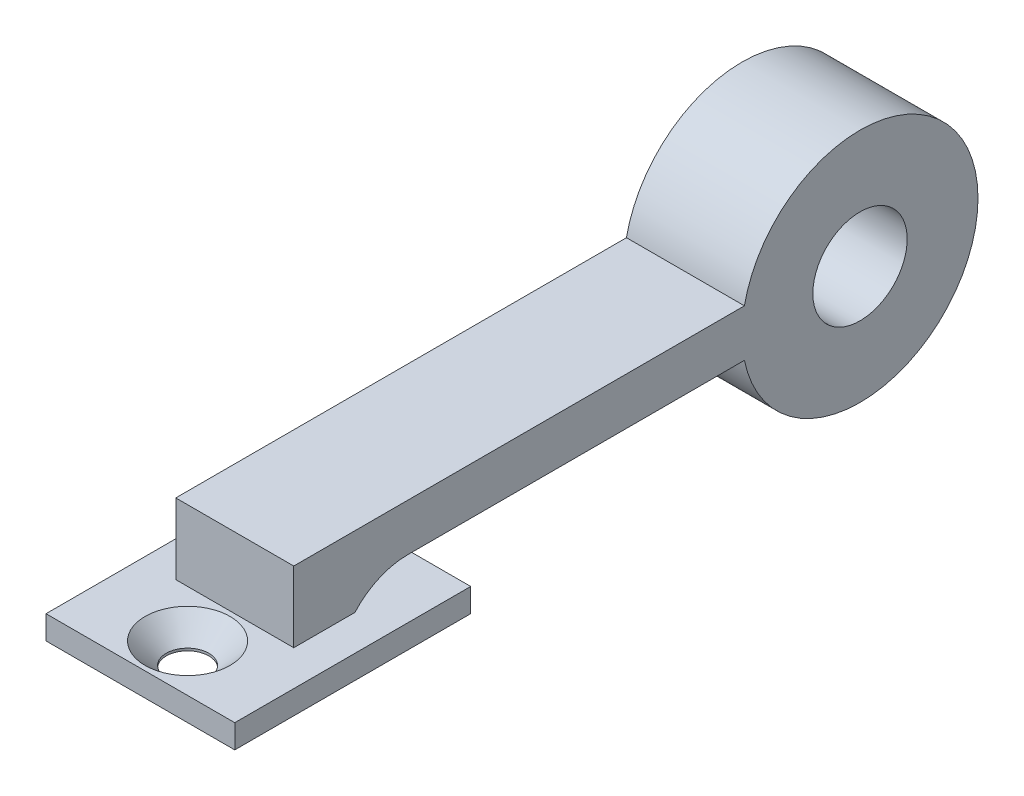
ISO-10303-21;
HEADER;
FILE_DESCRIPTION(('STEP AP214'),'2;1');
FILE_NAME('part.step','',(''),(''),'','','');
FILE_SCHEMA(('AUTOMOTIVE_DESIGN { 1 0 10303 214 1 1 1 1 }'));
ENDSEC;
DATA;
#1=APPLICATION_CONTEXT('core data for automotive mechanical design processes');
#2=APPLICATION_PROTOCOL_DEFINITION('international standard','automotive_design',2000,#1);
#3=PRODUCT_CONTEXT('',#1,'mechanical');
#4=PRODUCT('Part','Part','',(#3));
#5=PRODUCT_RELATED_PRODUCT_CATEGORY('part','',(#4));
#6=PRODUCT_DEFINITION_FORMATION('','',#4);
#7=PRODUCT_DEFINITION_CONTEXT('part definition',#1,'design');
#8=PRODUCT_DEFINITION('design','',#6,#7);
#9=PRODUCT_DEFINITION_SHAPE('','',#8);
#10=(LENGTH_UNIT() NAMED_UNIT(*) SI_UNIT(.MILLI.,.METRE.));
#11=(NAMED_UNIT(*) PLANE_ANGLE_UNIT() SI_UNIT($,.RADIAN.));
#12=(NAMED_UNIT(*) SI_UNIT($,.STERADIAN.) SOLID_ANGLE_UNIT());
#13=UNCERTAINTY_MEASURE_WITH_UNIT(LENGTH_MEASURE(1.E-05),#10,'distance_accuracy_value','');
#14=(GEOMETRIC_REPRESENTATION_CONTEXT(3) GLOBAL_UNCERTAINTY_ASSIGNED_CONTEXT((#13)) GLOBAL_UNIT_ASSIGNED_CONTEXT((#10,
#11,#12)) REPRESENTATION_CONTEXT('',''));
#15=CARTESIAN_POINT('',(0.,0.,0.));
#16=DIRECTION('',(0.,0.,1.));
#17=DIRECTION('',(1.,0.,0.));
#18=AXIS2_PLACEMENT_3D('',#15,#16,#17);
#19=CARTESIAN_POINT('',(4.99999999999989,0.,1.));
#20=DIRECTION('',(0.,0.,-0.999999999999999));
#21=DIRECTION('',(0.,1.,0.));
#22=AXIS2_PLACEMENT_3D('',#19,#20,#21);
#23=PLANE('',#22);
#24=DIRECTION('',(-0.999999999999996,0.,0.));
#25=VECTOR('',#24,1.);
#26=CARTESIAN_POINT('',(4.99999999999989,0.99999999999989,1.));
#27=LINE('',#26,#25);
#28=CARTESIAN_POINT('',(4.99999999999989,1.00000000000011,1.));
#29=VERTEX_POINT('',#28);
#30=CARTESIAN_POINT('',(0.,0.99999999999989,1.));
#31=VERTEX_POINT('',#30);
#32=EDGE_CURVE('E95',#29,#31,#27,.T.);
#33=ORIENTED_EDGE('',*,*,#32,.F.);
#34=DIRECTION('',(0.,-1.,0.));
#35=VECTOR('',#34,1.);
#36=CARTESIAN_POINT('',(4.99999999999989,0.,1.));
#37=LINE('',#36,#35);
#38=CARTESIAN_POINT('',(4.99999999999989,4.,1.));
#39=VERTEX_POINT('',#38);
#40=EDGE_CURVE('E207',#39,#29,#37,.T.);
#41=ORIENTED_EDGE('',*,*,#40,.F.);
#42=DIRECTION('',(-0.999999999999996,0.,0.));
#43=VECTOR('',#42,1.);
#44=CARTESIAN_POINT('',(4.99999999999989,4.,1.));
#45=LINE('',#44,#43);
#46=CARTESIAN_POINT('',(0.,4.,1.));
#47=VERTEX_POINT('',#46);
#48=EDGE_CURVE('E221',#39,#47,#45,.T.);
#49=ORIENTED_EDGE('',*,*,#48,.T.);
#50=DIRECTION('',(0.,-1.,0.));
#51=VECTOR('',#50,1.);
#52=CARTESIAN_POINT('',(0.,0.,1.));
#53=LINE('',#52,#51);
#54=EDGE_CURVE('E215',#47,#31,#53,.T.);
#55=ORIENTED_EDGE('',*,*,#54,.T.);
#56=EDGE_LOOP('',(#33,#41,#49,#55));
#57=FACE_BOUND('',#56,.T.);
#58=ADVANCED_FACE('F72',(#57),#23,.F.);
#59=CARTESIAN_POINT('',(0.,0.,0.));
#60=DIRECTION('',(0.999999999999996,0.,0.));
#61=DIRECTION('',(0.,0.,-0.999999999999999));
#62=AXIS2_PLACEMENT_3D('',#59,#60,#61);
#63=PLANE('',#62);
#64=CARTESIAN_POINT('',(0.,2.99999999999989,-23.));
#65=DIRECTION('',(0.999999999999996,0.,0.));
#66=DIRECTION('',(0.,0.,-0.999999999999999));
#67=AXIS2_PLACEMENT_3D('',#64,#65,#66);
#68=CIRCLE('',#67,2.);
#69=CARTESIAN_POINT('',(0.,2.99999999999989,-21.));
#70=VERTEX_POINT('',#69);
#71=EDGE_CURVE('E204',#70,#70,#68,.T.);
#72=ORIENTED_EDGE('',*,*,#71,.T.);
#73=EDGE_LOOP('',(#72));
#74=FACE_BOUND('',#73,.T.);
#75=DIRECTION('',(0.,0.,-0.999999999999999));
#76=VECTOR('',#75,1.);
#77=CARTESIAN_POINT('',(0.,0.99999999999989,0.));
#78=LINE('',#77,#76);
#79=CARTESIAN_POINT('',(0.,0.99999999999989,-1.59235914724642));
#80=VERTEX_POINT('',#79);
#81=EDGE_CURVE('E88',#31,#80,#78,.T.);
#82=ORIENTED_EDGE('',*,*,#81,.F.);
#83=ORIENTED_EDGE('',*,*,#54,.F.);
#84=DIRECTION('',(0.,0.,0.999999999999999));
#85=VECTOR('',#84,1.);
#86=CARTESIAN_POINT('',(0.,4.,0.));
#87=LINE('',#86,#85);
#88=CARTESIAN_POINT('',(0.,4.,-18.1010205144336));
#89=VERTEX_POINT('',#88);
#90=EDGE_CURVE('E213',#89,#47,#87,.T.);
#91=ORIENTED_EDGE('',*,*,#90,.F.);
#92=CARTESIAN_POINT('',(0.,2.99999999999989,-23.));
#93=DIRECTION('',(0.999999999999996,0.,0.));
#94=DIRECTION('',(0.,0.,-0.999999999999999));
#95=AXIS2_PLACEMENT_3D('',#92,#93,#94);
#96=CIRCLE('',#95,5.);
#97=CARTESIAN_POINT('',(0.,2.,-18.1010205144336));
#98=VERTEX_POINT('',#97);
#99=EDGE_CURVE('E230',#98,#89,#96,.T.);
#100=ORIENTED_EDGE('',*,*,#99,.F.);
#101=DIRECTION('',(0.,0.,-0.999999999999999));
#102=VECTOR('',#101,1.);
#103=CARTESIAN_POINT('',(0.,2.,0.));
#104=LINE('',#103,#102);
#105=CARTESIAN_POINT('',(0.,2.,-3.82842712474618));
#106=VERTEX_POINT('',#105);
#107=EDGE_CURVE('E208',#106,#98,#104,.T.);
#108=ORIENTED_EDGE('',*,*,#107,.F.);
#109=CARTESIAN_POINT('',(0.,-0.99999999999989,-3.82842712474618));
#110=DIRECTION('',(0.999999999999996,0.,0.));
#111=DIRECTION('',(0.,0.,-0.999999999999999));
#112=AXIS2_PLACEMENT_3D('',#109,#110,#111);
#113=CIRCLE('',#112,3.);
#114=EDGE_CURVE('E239',#106,#80,#113,.T.);
#115=ORIENTED_EDGE('',*,*,#114,.T.);
#116=EDGE_LOOP('',(#82,#83,#91,#100,#108,#115));
#117=FACE_BOUND('',#116,.T.);
#118=ADVANCED_FACE('F252',(#74,#117),#63,.F.);
#119=CARTESIAN_POINT('',(4.99999999999989,0.,0.));
#120=DIRECTION('',(0.999999999999996,0.,0.));
#121=DIRECTION('',(0.,0.,-0.999999999999999));
#122=AXIS2_PLACEMENT_3D('',#119,#120,#121);
#123=PLANE('',#122);
#124=CARTESIAN_POINT('',(4.99999999999995,2.99999999999989,-23.));
#125=DIRECTION('',(0.999999999999996,0.,0.));
#126=DIRECTION('',(0.,0.,-0.999999999999999));
#127=AXIS2_PLACEMENT_3D('',#124,#125,#126);
#128=CIRCLE('',#127,2.);
#129=CARTESIAN_POINT('',(4.99999999999995,2.99999999999989,-21.));
#130=VERTEX_POINT('',#129);
#131=EDGE_CURVE('E227',#130,#130,#128,.T.);
#132=ORIENTED_EDGE('',*,*,#131,.F.);
#133=EDGE_LOOP('',(#132));
#134=FACE_BOUND('',#133,.T.);
#135=ORIENTED_EDGE('',*,*,#40,.T.);
#136=DIRECTION('',(0.,0.,-0.999999999999999));
#137=VECTOR('',#136,1.);
#138=CARTESIAN_POINT('',(4.99999999999989,0.99999999999989,0.));
#139=LINE('',#138,#137);
#140=CARTESIAN_POINT('',(4.99999999999989,0.99999999999989,-1.59235914724642));
#141=VERTEX_POINT('',#140);
#142=EDGE_CURVE('E196',#29,#141,#139,.T.);
#143=ORIENTED_EDGE('',*,*,#142,.T.);
#144=CARTESIAN_POINT('',(4.99999999999989,-0.99999999999989,-3.82842712474618));
#145=DIRECTION('',(0.999999999999996,0.,0.));
#146=DIRECTION('',(0.,0.,-0.999999999999999));
#147=AXIS2_PLACEMENT_3D('',#144,#145,#146);
#148=CIRCLE('',#147,3.);
#149=CARTESIAN_POINT('',(4.99999999999989,2.,-3.82842712474618));
#150=VERTEX_POINT('',#149);
#151=EDGE_CURVE('E81',#141,#150,#148,.F.);
#152=ORIENTED_EDGE('',*,*,#151,.T.);
#153=DIRECTION('',(0.,0.,-0.999999999999999));
#154=VECTOR('',#153,1.);
#155=CARTESIAN_POINT('',(4.99999999999989,2.,0.));
#156=LINE('',#155,#154);
#157=CARTESIAN_POINT('',(4.99999999999995,2.,-18.1010205144336));
#158=VERTEX_POINT('',#157);
#159=EDGE_CURVE('E210',#150,#158,#156,.T.);
#160=ORIENTED_EDGE('',*,*,#159,.T.);
#161=CARTESIAN_POINT('',(4.99999999999995,2.99999999999989,-23.));
#162=DIRECTION('',(0.999999999999996,0.,0.));
#163=DIRECTION('',(0.,0.,-0.999999999999999));
#164=AXIS2_PLACEMENT_3D('',#161,#162,#163);
#165=CIRCLE('',#164,5.);
#166=CARTESIAN_POINT('',(4.99999999999995,4.,-18.1010205144336));
#167=VERTEX_POINT('',#166);
#168=EDGE_CURVE('E216',#158,#167,#165,.T.);
#169=ORIENTED_EDGE('',*,*,#168,.T.);
#170=DIRECTION('',(0.,0.,0.999999999999999));
#171=VECTOR('',#170,1.);
#172=CARTESIAN_POINT('',(4.99999999999989,4.,0.));
#173=LINE('',#172,#171);
#174=EDGE_CURVE('E205',#167,#39,#173,.T.);
#175=ORIENTED_EDGE('',*,*,#174,.T.);
#176=EDGE_LOOP('',(#135,#143,#152,#160,#169,#175));
#177=FACE_BOUND('',#176,.T.);
#178=ADVANCED_FACE('F243',(#134,#177),#123,.T.);
#179=CARTESIAN_POINT('',(4.99999999999989,-0.99999999999989,-3.82842712474618));
#180=DIRECTION('',(-0.999999999999996,0.,0.));
#181=DIRECTION('',(0.,0.,0.999999999999999));
#182=AXIS2_PLACEMENT_3D('',#179,#180,#181);
#183=CYLINDRICAL_SURFACE('',#182,3.);
#184=DIRECTION('',(-0.999999999999996,0.,0.));
#185=VECTOR('',#184,1.);
#186=CARTESIAN_POINT('',(4.99999999999989,0.99999999999989,-1.59235914724642));
#187=LINE('',#186,#185);
#188=EDGE_CURVE('E12',#80,#141,#187,.F.);
#189=ORIENTED_EDGE('',*,*,#188,.F.);
#190=ORIENTED_EDGE('',*,*,#114,.F.);
#191=DIRECTION('',(-0.999999999999996,0.,0.));
#192=VECTOR('',#191,1.);
#193=CARTESIAN_POINT('',(4.99999999999989,2.,-3.82842712474618));
#194=LINE('',#193,#192);
#195=EDGE_CURVE('E226',#150,#106,#194,.T.);
#196=ORIENTED_EDGE('',*,*,#195,.F.);
#197=ORIENTED_EDGE('',*,*,#151,.F.);
#198=EDGE_LOOP('',(#189,#190,#196,#197));
#199=FACE_BOUND('',#198,.T.);
#200=ADVANCED_FACE('F74',(#199),#183,.F.);
#201=CARTESIAN_POINT('',(4.99999999999989,4.,0.));
#202=DIRECTION('',(0.,-1.,0.));
#203=DIRECTION('',(0.,0.,-0.999999999999999));
#204=AXIS2_PLACEMENT_3D('',#201,#202,#203);
#205=PLANE('',#204);
#206=ORIENTED_EDGE('',*,*,#90,.T.);
#207=ORIENTED_EDGE('',*,*,#48,.F.);
#208=ORIENTED_EDGE('',*,*,#174,.F.);
#209=DIRECTION('',(-0.999999999999996,0.,0.));
#210=VECTOR('',#209,1.);
#211=CARTESIAN_POINT('',(4.99999999999995,4.,-18.1010205144336));
#212=LINE('',#211,#210);
#213=EDGE_CURVE('E224',#167,#89,#212,.T.);
#214=ORIENTED_EDGE('',*,*,#213,.T.);
#215=EDGE_LOOP('',(#206,#207,#208,#214));
#216=FACE_BOUND('',#215,.T.);
#217=ADVANCED_FACE('F284',(#216),#205,.F.);
#218=CARTESIAN_POINT('',(4.99999999999989,2.,0.));
#219=DIRECTION('',(0.,1.,0.));
#220=DIRECTION('',(0.,0.,0.999999999999999));
#221=AXIS2_PLACEMENT_3D('',#218,#219,#220);
#222=PLANE('',#221);
#223=ORIENTED_EDGE('',*,*,#159,.F.);
#224=ORIENTED_EDGE('',*,*,#195,.T.);
#225=ORIENTED_EDGE('',*,*,#107,.T.);
#226=DIRECTION('',(-0.999999999999996,0.,0.));
#227=VECTOR('',#226,1.);
#228=CARTESIAN_POINT('',(4.99999999999995,2.,-18.1010205144336));
#229=LINE('',#228,#227);
#230=EDGE_CURVE('E212',#158,#98,#229,.T.);
#231=ORIENTED_EDGE('',*,*,#230,.F.);
#232=EDGE_LOOP('',(#223,#224,#225,#231));
#233=FACE_BOUND('',#232,.T.);
#234=ADVANCED_FACE('F249',(#233),#222,.F.);
#235=CARTESIAN_POINT('',(4.99999999999995,2.99999999999989,-23.));
#236=DIRECTION('',(-0.999999999999996,0.,0.));
#237=DIRECTION('',(0.,0.,0.999999999999999));
#238=AXIS2_PLACEMENT_3D('',#235,#236,#237);
#239=CYLINDRICAL_SURFACE('',#238,2.);
#240=CARTESIAN_POINT('',(4.99999999999995,2.99999999999989,-21.));
#241=CARTESIAN_POINT('',(4.94791666666662,2.99999999999989,-21.));
#242=CARTESIAN_POINT('',(4.89583333333329,2.99999999999989,-21.));
#243=CARTESIAN_POINT('',(4.79166666666662,2.99999999999989,-21.));
#244=CARTESIAN_POINT('',(4.73958333333329,2.99999999999989,-21.));
#245=CARTESIAN_POINT('',(4.63541666666662,2.99999999999989,-21.));
#246=CARTESIAN_POINT('',(4.58333333333329,2.99999999999989,-21.));
#247=CARTESIAN_POINT('',(4.47916666666663,2.99999999999989,-21.));
#248=CARTESIAN_POINT('',(4.42708333333329,2.99999999999989,-21.));
#249=CARTESIAN_POINT('',(4.32291666666663,2.99999999999989,-21.));
#250=CARTESIAN_POINT('',(4.2708333333333,2.99999999999989,-21.));
#251=CARTESIAN_POINT('',(4.16666666666663,2.99999999999989,-21.));
#252=CARTESIAN_POINT('',(4.1145833333333,2.99999999999989,-21.));
#253=CARTESIAN_POINT('',(4.01041666666664,2.99999999999989,-21.));
#254=CARTESIAN_POINT('',(3.9583333333333,2.99999999999989,-21.));
#255=CARTESIAN_POINT('',(3.85416666666664,2.99999999999989,-21.));
#256=CARTESIAN_POINT('',(3.80208333333331,2.99999999999989,-21.));
#257=CARTESIAN_POINT('',(3.69791666666664,2.99999999999989,-21.));
#258=CARTESIAN_POINT('',(3.64583333333331,2.99999999999989,-21.));
#259=CARTESIAN_POINT('',(3.54166666666665,2.99999999999989,-21.));
#260=CARTESIAN_POINT('',(3.48958333333331,2.99999999999989,-21.));
#261=CARTESIAN_POINT('',(3.38541666666665,2.99999999999989,-21.));
#262=CARTESIAN_POINT('',(3.33333333333332,2.99999999999989,-21.));
#263=CARTESIAN_POINT('',(3.22916666666665,2.99999999999989,-21.));
#264=CARTESIAN_POINT('',(3.17708333333332,2.99999999999989,-21.));
#265=CARTESIAN_POINT('',(3.07291666666666,2.99999999999989,-21.));
#266=CARTESIAN_POINT('',(3.02083333333332,2.99999999999989,-21.));
#267=CARTESIAN_POINT('',(2.91666666666666,2.99999999999989,-21.));
#268=CARTESIAN_POINT('',(2.86458333333333,2.99999999999989,-21.));
#269=CARTESIAN_POINT('',(2.76041666666666,2.99999999999989,-21.));
#270=CARTESIAN_POINT('',(2.70833333333333,2.99999999999989,-21.));
#271=CARTESIAN_POINT('',(2.60416666666667,2.99999999999989,-21.));
#272=CARTESIAN_POINT('',(2.55208333333333,2.99999999999989,-21.));
#273=CARTESIAN_POINT('',(2.44791666666667,2.99999999999989,-21.));
#274=CARTESIAN_POINT('',(2.39583333333334,2.99999999999989,-21.));
#275=CARTESIAN_POINT('',(2.29166666666667,2.99999999999989,-21.));
#276=CARTESIAN_POINT('',(2.23958333333334,2.99999999999989,-21.));
#277=CARTESIAN_POINT('',(2.13541666666668,2.99999999999989,-21.));
#278=CARTESIAN_POINT('',(2.08333333333334,2.99999999999989,-21.));
#279=CARTESIAN_POINT('',(1.97916666666668,2.99999999999989,-21.));
#280=CARTESIAN_POINT('',(1.92708333333335,2.99999999999989,-21.));
#281=CARTESIAN_POINT('',(1.82291666666668,2.99999999999989,-21.));
#282=CARTESIAN_POINT('',(1.77083333333335,2.99999999999989,-21.));
#283=CARTESIAN_POINT('',(1.66666666666669,2.99999999999989,-21.));
#284=CARTESIAN_POINT('',(1.61458333333335,2.99999999999989,-21.));
#285=CARTESIAN_POINT('',(1.51041666666669,2.99999999999989,-21.));
#286=CARTESIAN_POINT('',(1.45833333333336,2.99999999999989,-21.));
#287=CARTESIAN_POINT('',(1.35416666666669,2.99999999999989,-21.));
#288=CARTESIAN_POINT('',(1.30208333333336,2.99999999999989,-21.));
#289=CARTESIAN_POINT('',(1.1979166666667,2.99999999999989,-21.));
#290=CARTESIAN_POINT('',(1.14583333333336,2.99999999999989,-21.));
#291=CARTESIAN_POINT('',(1.0416666666667,2.99999999999989,-21.));
#292=CARTESIAN_POINT('',(0.989583333333368,2.99999999999989,-21.));
#293=CARTESIAN_POINT('',(0.885416666666703,2.99999999999989,-21.));
#294=CARTESIAN_POINT('',(0.833333333333371,2.99999999999989,-21.));
#295=CARTESIAN_POINT('',(0.729166666666706,2.99999999999989,-21.));
#296=CARTESIAN_POINT('',(0.677083333333374,2.99999999999989,-21.));
#297=CARTESIAN_POINT('',(0.572916666666709,2.99999999999989,-21.));
#298=CARTESIAN_POINT('',(0.520833333333377,2.99999999999989,-21.));
#299=CARTESIAN_POINT('',(0.416666666666713,2.99999999999989,-21.));
#300=CARTESIAN_POINT('',(0.364583333333381,2.99999999999989,-21.));
#301=CARTESIAN_POINT('',(0.260416666666717,2.99999999999989,-21.));
#302=CARTESIAN_POINT('',(0.208333333333384,2.99999999999989,-21.));
#303=CARTESIAN_POINT('',(0.10416666666672,2.99999999999989,-21.));
#304=CARTESIAN_POINT('',(0.0520833333333877,2.99999999999989,-21.));
#305=CARTESIAN_POINT('',(0.,2.99999999999989,-21.));
#306=B_SPLINE_CURVE_WITH_KNOTS('',3,(#240,#241,#242,#243,#244,#245,#246,#247,#248,#249,#250,
#251,#252,#253,#254,#255,#256,#257,#258,#259,#260,#261,#262,#263,#264,#265,#266,#267,#268,#269,
#270,#271,#272,#273,#274,#275,#276,#277,#278,#279,#280,#281,#282,#283,#284,#285,#286,#287,#288,
#289,#290,#291,#292,#293,#294,#295,#296,#297,#298,#299,#300,#301,#302,#303,#304,#305),
.UNSPECIFIED.,.F.,.F.,(4,2,2,2,2,2,2,2,2,2,2,2,2,2,2,2,2,2,2,2,2,2,2,2,2,2,2,2,2,2,2,2,4),(0.,
0.156249999999998,0.312499999999994,0.468749999999991,0.624999999999988,0.781249999999984,
0.937499999999981,1.09374999999998,1.24999999999997,1.40624999999997,1.56249999999997,
1.71874999999996,1.87499999999996,2.03124999999996,2.18749999999995,2.34374999999995,
2.49999999999995,2.65624999999994,2.81249999999994,2.96874999999994,3.12499999999993,
3.28124999999993,3.43749999999993,3.59374999999992,3.74999999999992,3.90624999999992,
4.06249999999991,4.21874999999991,4.37499999999991,4.5312499999999,4.6874999999999,
4.8437499999999,4.99999999999989),.UNSPECIFIED.);
#307=EDGE_CURVE('BSEAM258',#130,#70,#306,.T.);
#308=ORIENTED_EDGE('',*,*,#131,.T.);
#309=ORIENTED_EDGE('',*,*,#71,.F.);
#310=ORIENTED_EDGE('',*,*,#307,.T.);
#311=ORIENTED_EDGE('',*,*,#307,.F.);
#312=EDGE_LOOP('',(#308,#310,#309,#311));
#313=FACE_BOUND('',#312,.T.);
#314=ADVANCED_FACE('F258',(#313),#239,.F.);
#315=CARTESIAN_POINT('',(4.99999999999995,2.99999999999989,-23.));
#316=DIRECTION('',(-0.999999999999996,0.,0.));
#317=DIRECTION('',(0.,0.,0.999999999999999));
#318=AXIS2_PLACEMENT_3D('',#315,#316,#317);
#319=CYLINDRICAL_SURFACE('',#318,5.);
#320=ORIENTED_EDGE('',*,*,#99,.T.);
#321=ORIENTED_EDGE('',*,*,#213,.F.);
#322=ORIENTED_EDGE('',*,*,#168,.F.);
#323=ORIENTED_EDGE('',*,*,#230,.T.);
#324=EDGE_LOOP('',(#320,#321,#322,#323));
#325=FACE_BOUND('',#324,.T.);
#326=ADVANCED_FACE('F255',(#325),#319,.T.);
#327=CARTESIAN_POINT('',(0.,0.99999999999989,0.));
#328=DIRECTION('',(0.,-1.,0.));
#329=DIRECTION('',(0.,0.,-0.999999999999999));
#330=AXIS2_PLACEMENT_3D('',#327,#328,#329);
#331=PLANE('',#330);
#332=CARTESIAN_POINT('',(2.49999999999995,0.99999999999989,3.));
#333=DIRECTION('',(0.,1.,0.));
#334=DIRECTION('',(0.,0.,0.999999999999999));
#335=AXIS2_PLACEMENT_3D('',#332,#333,#334);
#336=CIRCLE('',#335,1.8);
#337=CARTESIAN_POINT('',(2.49999999999995,0.999999999999889,4.8));
#338=VERTEX_POINT('',#337);
#339=EDGE_CURVE('E331',#338,#338,#336,.T.);
#340=ORIENTED_EDGE('',*,*,#339,.F.);
#341=EDGE_LOOP('',(#340));
#342=FACE_BOUND('',#341,.T.);
#343=DIRECTION('',(0.,0.,-0.999999999999999));
#344=VECTOR('',#343,1.);
#345=CARTESIAN_POINT('',(-1.50000000000006,0.99999999999989,-5.));
#346=LINE('',#345,#344);
#347=CARTESIAN_POINT('',(-1.50000000000006,0.99999999999989,5.));
#348=VERTEX_POINT('',#347);
#349=CARTESIAN_POINT('',(-1.50000000000006,0.99999999999989,-5.));
#350=VERTEX_POINT('',#349);
#351=EDGE_CURVE('E172',#348,#350,#346,.T.);
#352=ORIENTED_EDGE('',*,*,#351,.F.);
#353=DIRECTION('',(-0.999999999999996,0.,0.));
#354=VECTOR('',#353,1.);
#355=CARTESIAN_POINT('',(6.49999999999995,0.99999999999989,5.));
#356=LINE('',#355,#354);
#357=CARTESIAN_POINT('',(6.49999999999995,0.99999999999989,5.));
#358=VERTEX_POINT('',#357);
#359=EDGE_CURVE('E164',#358,#348,#356,.T.);
#360=ORIENTED_EDGE('',*,*,#359,.F.);
#361=DIRECTION('',(0.,0.,0.999999999999999));
#362=VECTOR('',#361,1.);
#363=CARTESIAN_POINT('',(6.49999999999995,0.99999999999989,-5.));
#364=LINE('',#363,#362);
#365=CARTESIAN_POINT('',(6.49999999999995,0.99999999999989,-5.));
#366=VERTEX_POINT('',#365);
#367=EDGE_CURVE('E175',#366,#358,#364,.T.);
#368=ORIENTED_EDGE('',*,*,#367,.F.);
#369=DIRECTION('',(0.999999999999996,0.,0.));
#370=VECTOR('',#369,1.);
#371=CARTESIAN_POINT('',(6.49999999999995,0.99999999999989,-5.));
#372=LINE('',#371,#370);
#373=EDGE_CURVE('E156',#350,#366,#372,.T.);
#374=ORIENTED_EDGE('',*,*,#373,.F.);
#375=EDGE_LOOP('',(#352,#360,#368,#374));
#376=FACE_BOUND('',#375,.T.);
#377=ORIENTED_EDGE('',*,*,#142,.F.);
#378=ORIENTED_EDGE('',*,*,#32,.T.);
#379=ORIENTED_EDGE('',*,*,#81,.T.);
#380=ORIENTED_EDGE('',*,*,#188,.T.);
#381=EDGE_LOOP('',(#377,#378,#379,#380));
#382=FACE_BOUND('',#381,.T.);
#383=ADVANCED_FACE('F169',(#342,#376,#382),#331,.F.);
#384=CARTESIAN_POINT('',(-1.50000000000006,0.99999999999989,-5.));
#385=DIRECTION('',(-0.999999999999996,0.,0.));
#386=DIRECTION('',(0.,0.,0.999999999999999));
#387=AXIS2_PLACEMENT_3D('',#384,#385,#386);
#388=PLANE('',#387);
#389=DIRECTION('',(0.,0.,-0.999999999999999));
#390=VECTOR('',#389,1.);
#391=CARTESIAN_POINT('',(-1.50000000000006,0.,-5.));
#392=LINE('',#391,#390);
#393=CARTESIAN_POINT('',(-1.50000000000006,0.,5.));
#394=VERTEX_POINT('',#393);
#395=CARTESIAN_POINT('',(-1.50000000000006,0.,-5.));
#396=VERTEX_POINT('',#395);
#397=EDGE_CURVE('E190',#394,#396,#392,.T.);
#398=ORIENTED_EDGE('',*,*,#397,.F.);
#399=DIRECTION('',(0.,-1.,0.));
#400=VECTOR('',#399,1.);
#401=CARTESIAN_POINT('',(-1.50000000000006,0.99999999999989,5.));
#402=LINE('',#401,#400);
#403=EDGE_CURVE('E178',#348,#394,#402,.T.);
#404=ORIENTED_EDGE('',*,*,#403,.F.);
#405=ORIENTED_EDGE('',*,*,#351,.T.);
#406=DIRECTION('',(0.,-1.,0.));
#407=VECTOR('',#406,1.);
#408=CARTESIAN_POINT('',(-1.50000000000006,0.99999999999989,-5.));
#409=LINE('',#408,#407);
#410=EDGE_CURVE('E153',#350,#396,#409,.T.);
#411=ORIENTED_EDGE('',*,*,#410,.T.);
#412=EDGE_LOOP('',(#398,#404,#405,#411));
#413=FACE_BOUND('',#412,.T.);
#414=ADVANCED_FACE('F177',(#413),#388,.T.);
#415=CARTESIAN_POINT('',(6.49999999999995,0.99999999999989,5.));
#416=DIRECTION('',(0.,0.,0.999999999999999));
#417=DIRECTION('',(0.,-1.,0.));
#418=AXIS2_PLACEMENT_3D('',#415,#416,#417);
#419=PLANE('',#418);
#420=DIRECTION('',(-0.999999999999996,0.,0.));
#421=VECTOR('',#420,1.);
#422=CARTESIAN_POINT('',(6.49999999999995,0.,5.));
#423=LINE('',#422,#421);
#424=CARTESIAN_POINT('',(6.49999999999995,0.,5.));
#425=VERTEX_POINT('',#424);
#426=EDGE_CURVE('E179',#425,#394,#423,.T.);
#427=ORIENTED_EDGE('',*,*,#426,.F.);
#428=DIRECTION('',(0.,-1.,0.));
#429=VECTOR('',#428,1.);
#430=CARTESIAN_POINT('',(6.49999999999995,0.99999999999989,5.));
#431=LINE('',#430,#429);
#432=EDGE_CURVE('E197',#358,#425,#431,.T.);
#433=ORIENTED_EDGE('',*,*,#432,.F.);
#434=ORIENTED_EDGE('',*,*,#359,.T.);
#435=ORIENTED_EDGE('',*,*,#403,.T.);
#436=EDGE_LOOP('',(#427,#433,#434,#435));
#437=FACE_BOUND('',#436,.T.);
#438=ADVANCED_FACE('F264',(#437),#419,.T.);
#439=CARTESIAN_POINT('',(6.49999999999995,0.99999999999989,-5.));
#440=DIRECTION('',(0.999999999999996,0.,0.));
#441=DIRECTION('',(0.,0.,-0.999999999999999));
#442=AXIS2_PLACEMENT_3D('',#439,#440,#441);
#443=PLANE('',#442);
#444=DIRECTION('',(0.,0.,0.999999999999999));
#445=VECTOR('',#444,1.);
#446=CARTESIAN_POINT('',(6.49999999999995,0.,-5.));
#447=LINE('',#446,#445);
#448=CARTESIAN_POINT('',(6.49999999999995,0.,-5.));
#449=VERTEX_POINT('',#448);
#450=EDGE_CURVE('E182',#449,#425,#447,.T.);
#451=ORIENTED_EDGE('',*,*,#450,.F.);
#452=DIRECTION('',(0.,-1.,0.));
#453=VECTOR('',#452,1.);
#454=CARTESIAN_POINT('',(6.49999999999995,0.99999999999989,-5.));
#455=LINE('',#454,#453);
#456=EDGE_CURVE('E163',#366,#449,#455,.T.);
#457=ORIENTED_EDGE('',*,*,#456,.F.);
#458=ORIENTED_EDGE('',*,*,#367,.T.);
#459=ORIENTED_EDGE('',*,*,#432,.T.);
#460=EDGE_LOOP('',(#451,#457,#458,#459));
#461=FACE_BOUND('',#460,.T.);
#462=ADVANCED_FACE('F308',(#461),#443,.T.);
#463=CARTESIAN_POINT('',(6.49999999999995,0.99999999999989,-5.));
#464=DIRECTION('',(0.,0.,-0.999999999999999));
#465=DIRECTION('',(0.,1.,0.));
#466=AXIS2_PLACEMENT_3D('',#463,#464,#465);
#467=PLANE('',#466);
#468=DIRECTION('',(0.999999999999996,0.,0.));
#469=VECTOR('',#468,1.);
#470=CARTESIAN_POINT('',(6.49999999999995,0.,-5.));
#471=LINE('',#470,#469);
#472=EDGE_CURVE('E158',#396,#449,#471,.T.);
#473=ORIENTED_EDGE('',*,*,#472,.F.);
#474=ORIENTED_EDGE('',*,*,#410,.F.);
#475=ORIENTED_EDGE('',*,*,#373,.T.);
#476=ORIENTED_EDGE('',*,*,#456,.T.);
#477=EDGE_LOOP('',(#473,#474,#475,#476));
#478=FACE_BOUND('',#477,.T.);
#479=ADVANCED_FACE('F155',(#478),#467,.T.);
#480=CARTESIAN_POINT('',(4.99999999999989,0.,0.));
#481=DIRECTION('',(0.,1.,0.));
#482=DIRECTION('',(0.,0.,0.999999999999999));
#483=AXIS2_PLACEMENT_3D('',#480,#481,#482);
#484=PLANE('',#483);
#485=CARTESIAN_POINT('',(2.49999999999995,0.,3.));
#486=DIRECTION('',(0.,1.,0.));
#487=DIRECTION('',(0.,0.,0.999999999999999));
#488=AXIS2_PLACEMENT_3D('',#485,#486,#487);
#489=CIRCLE('',#488,0.899999999999995);
#490=CARTESIAN_POINT('',(2.49999999999995,0.,3.9));
#491=VERTEX_POINT('',#490);
#492=EDGE_CURVE('E76',#491,#491,#489,.T.);
#493=ORIENTED_EDGE('',*,*,#492,.T.);
#494=EDGE_LOOP('',(#493));
#495=FACE_BOUND('',#494,.T.);
#496=ORIENTED_EDGE('',*,*,#397,.T.);
#497=ORIENTED_EDGE('',*,*,#472,.T.);
#498=ORIENTED_EDGE('',*,*,#450,.T.);
#499=ORIENTED_EDGE('',*,*,#426,.T.);
#500=EDGE_LOOP('',(#496,#497,#498,#499));
#501=FACE_BOUND('',#500,.T.);
#502=ADVANCED_FACE('F282',(#495,#501),#484,.F.);
#503=CARTESIAN_POINT('',(2.49999999999995,0.99999999999989,3.));
#504=DIRECTION('',(0.,1.,0.));
#505=DIRECTION('',(0.,0.,0.999999999999999));
#506=AXIS2_PLACEMENT_3D('',#503,#504,#505);
#507=CYLINDRICAL_SURFACE('',#506,0.899999999999995);
#508=CARTESIAN_POINT('',(2.49999999999995,0.099999999999989,3.));
#509=DIRECTION('',(0.,1.,0.));
#510=DIRECTION('',(0.,0.,0.999999999999999));
#511=AXIS2_PLACEMENT_3D('',#508,#509,#510);
#512=CIRCLE('',#511,0.899999999999996);
#513=CARTESIAN_POINT('',(2.49999999999995,0.0999999999999887,3.9));
#514=VERTEX_POINT('',#513);
#515=EDGE_CURVE('E185',#514,#514,#512,.T.);
#516=ORIENTED_EDGE('',*,*,#515,.T.);
#517=EDGE_LOOP('',(#516));
#518=FACE_BOUND('',#517,.T.);
#519=ORIENTED_EDGE('',*,*,#492,.F.);
#520=EDGE_LOOP('',(#519));
#521=FACE_BOUND('',#520,.T.);
#522=ADVANCED_FACE('F320',(#518,#521),#507,.F.);
#523=CARTESIAN_POINT('',(2.49999999999995,0.99999999999989,3.));
#524=DIRECTION('',(0.,1.,0.));
#525=DIRECTION('',(0.,0.,0.999999999999999));
#526=AXIS2_PLACEMENT_3D('',#523,#524,#525);
#527=CONICAL_SURFACE('',#526,1.8,0.785398163397448);
#528=ORIENTED_EDGE('',*,*,#515,.F.);
#529=EDGE_LOOP('',(#528));
#530=FACE_BOUND('',#529,.T.);
#531=ORIENTED_EDGE('',*,*,#339,.T.);
#532=EDGE_LOOP('',(#531));
#533=FACE_BOUND('',#532,.T.);
#534=ADVANCED_FACE('F325',(#530,#533),#527,.F.);
#535=CLOSED_SHELL('',(#58,#118,#178,#200,#217,#234,#314,#326,#383,#414,#438,#462,#479,#502,#522,#534));
#536=MANIFOLD_SOLID_BREP('B2',#535);
#537=ADVANCED_BREP_SHAPE_REPRESENTATION('',(#18,#536),#14);
#538=SHAPE_DEFINITION_REPRESENTATION(#9,#537);
ENDSEC;
END-ISO-10303-21;
